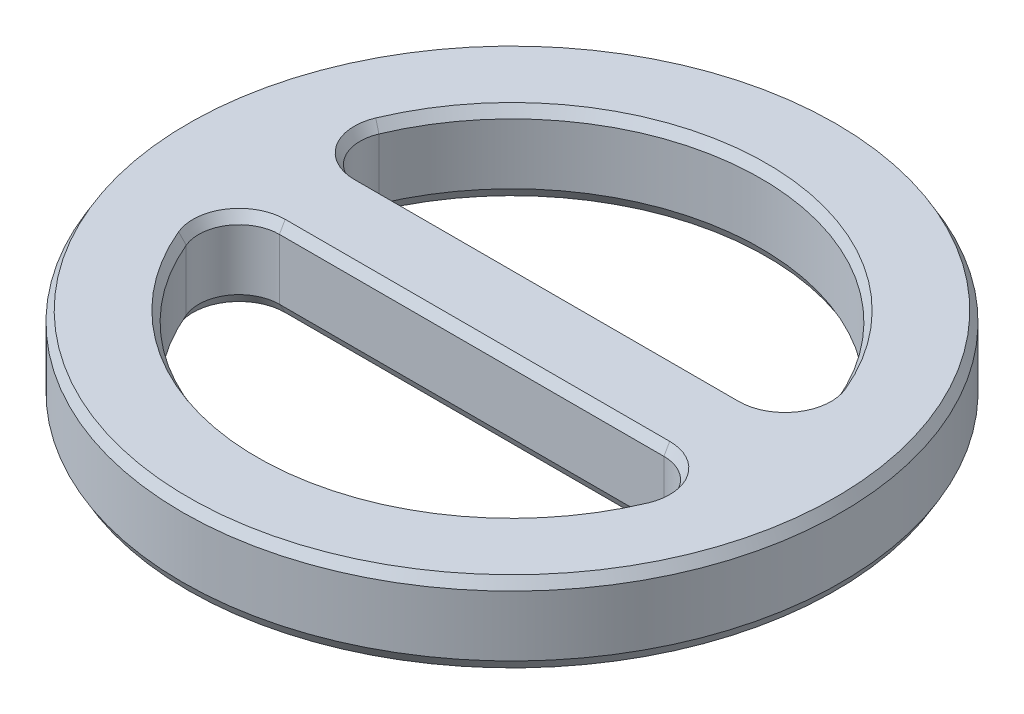
ISO-10303-21;
HEADER;
FILE_DESCRIPTION(('STEP AP214'),'2;1');
FILE_NAME('part.step','',(''),(''),'','','');
FILE_SCHEMA(('AUTOMOTIVE_DESIGN { 1 0 10303 214 1 1 1 1 }'));
ENDSEC;
DATA;
#1=APPLICATION_CONTEXT('core data for automotive mechanical design processes');
#2=APPLICATION_PROTOCOL_DEFINITION('international standard','automotive_design',2000,#1);
#3=PRODUCT_CONTEXT('',#1,'mechanical');
#4=PRODUCT('Part','Part','',(#3));
#5=PRODUCT_RELATED_PRODUCT_CATEGORY('part','',(#4));
#6=PRODUCT_DEFINITION_FORMATION('','',#4);
#7=PRODUCT_DEFINITION_CONTEXT('part definition',#1,'design');
#8=PRODUCT_DEFINITION('design','',#6,#7);
#9=PRODUCT_DEFINITION_SHAPE('','',#8);
#10=(LENGTH_UNIT() NAMED_UNIT(*) SI_UNIT(.MILLI.,.METRE.));
#11=(NAMED_UNIT(*) PLANE_ANGLE_UNIT() SI_UNIT($,.RADIAN.));
#12=(NAMED_UNIT(*) SI_UNIT($,.STERADIAN.) SOLID_ANGLE_UNIT());
#13=UNCERTAINTY_MEASURE_WITH_UNIT(LENGTH_MEASURE(1.E-05),#10,'distance_accuracy_value','');
#14=(GEOMETRIC_REPRESENTATION_CONTEXT(3) GLOBAL_UNCERTAINTY_ASSIGNED_CONTEXT((#13)) GLOBAL_UNIT_ASSIGNED_CONTEXT((#10,
#11,#12)) REPRESENTATION_CONTEXT('',''));
#15=CARTESIAN_POINT('',(0.,0.,0.));
#16=DIRECTION('',(0.,0.,1.));
#17=DIRECTION('',(1.,0.,0.));
#18=AXIS2_PLACEMENT_3D('',#15,#16,#17);
#19=CARTESIAN_POINT('',(0.,24.,0.));
#20=DIRECTION('',(0.,1.,0.));
#21=DIRECTION('',(0.,0.,1.));
#22=AXIS2_PLACEMENT_3D('',#19,#20,#21);
#23=PLANE('',#22);
#24=CARTESIAN_POINT('',(-57.1664237118258,24.,-24.));
#25=DIRECTION('',(0.,1.,0.));
#26=DIRECTION('',(0.,0.,1.));
#27=AXIS2_PLACEMENT_3D('',#24,#25,#26);
#28=CIRCLE('',#27,13.7320508075689);
#29=CARTESIAN_POINT('',(-57.1664237118258,24.,-10.2679491924311));
#30=VERTEX_POINT('',#29);
#31=CARTESIAN_POINT('',(-69.8279113714678,24.,-29.3156325706718));
#32=VERTEX_POINT('',#31);
#33=EDGE_CURVE('E204',#30,#32,#28,.F.);
#34=ORIENTED_EDGE('',*,*,#33,.T.);
#35=CARTESIAN_POINT('',(0.,24.,0.));
#36=DIRECTION('',(0.,1.,0.));
#37=DIRECTION('',(0.,0.,1.));
#38=AXIS2_PLACEMENT_3D('',#35,#36,#37);
#39=CIRCLE('',#38,75.7320508075689);
#40=CARTESIAN_POINT('',(69.8279113714678,24.,-29.3156325706718));
#41=VERTEX_POINT('',#40);
#42=EDGE_CURVE('E206',#32,#41,#39,.F.);
#43=ORIENTED_EDGE('',*,*,#42,.T.);
#44=CARTESIAN_POINT('',(57.1664237118258,24.,-24.));
#45=DIRECTION('',(0.,1.,0.));
#46=DIRECTION('',(0.,0.,1.));
#47=AXIS2_PLACEMENT_3D('',#44,#45,#46);
#48=CIRCLE('',#47,13.7320508075689);
#49=CARTESIAN_POINT('',(57.1664237118258,24.,-10.2679491924311));
#50=VERTEX_POINT('',#49);
#51=EDGE_CURVE('E202',#41,#50,#48,.F.);
#52=ORIENTED_EDGE('',*,*,#51,.T.);
#53=DIRECTION('',(-1.,0.,0.));
#54=VECTOR('',#53,1.);
#55=CARTESIAN_POINT('',(0.,24.,-10.2679491924311));
#56=LINE('',#55,#54);
#57=EDGE_CURVE('E200',#50,#30,#56,.T.);
#58=ORIENTED_EDGE('',*,*,#57,.T.);
#59=EDGE_LOOP('',(#34,#43,#52,#58));
#60=FACE_BOUND('',#59,.T.);
#61=CARTESIAN_POINT('',(57.1664237118258,24.,24.));
#62=DIRECTION('',(0.,1.,0.));
#63=DIRECTION('',(0.,0.,1.));
#64=AXIS2_PLACEMENT_3D('',#61,#62,#63);
#65=CIRCLE('',#64,13.7320508075689);
#66=CARTESIAN_POINT('',(57.1664237118258,24.,10.2679491924311));
#67=VERTEX_POINT('',#66);
#68=CARTESIAN_POINT('',(69.8279113714678,24.,29.3156325706719));
#69=VERTEX_POINT('',#68);
#70=EDGE_CURVE('E195',#67,#69,#65,.F.);
#71=ORIENTED_EDGE('',*,*,#70,.T.);
#72=CARTESIAN_POINT('',(0.,24.,0.));
#73=DIRECTION('',(0.,1.,0.));
#74=DIRECTION('',(0.,0.,1.));
#75=AXIS2_PLACEMENT_3D('',#72,#73,#74);
#76=CIRCLE('',#75,75.7320508075689);
#77=CARTESIAN_POINT('',(-69.8279113714678,24.,29.3156325706719));
#78=VERTEX_POINT('',#77);
#79=EDGE_CURVE('E197',#69,#78,#76,.F.);
#80=ORIENTED_EDGE('',*,*,#79,.T.);
#81=CARTESIAN_POINT('',(-57.1664237118258,24.,24.));
#82=DIRECTION('',(0.,1.,0.));
#83=DIRECTION('',(0.,0.,1.));
#84=AXIS2_PLACEMENT_3D('',#81,#82,#83);
#85=CIRCLE('',#84,13.7320508075689);
#86=CARTESIAN_POINT('',(-57.1664237118258,24.,10.2679491924311));
#87=VERTEX_POINT('',#86);
#88=EDGE_CURVE('E193',#78,#87,#85,.F.);
#89=ORIENTED_EDGE('',*,*,#88,.T.);
#90=DIRECTION('',(1.,0.,0.));
#91=VECTOR('',#90,1.);
#92=CARTESIAN_POINT('',(0.,24.,10.2679491924311));
#93=LINE('',#92,#91);
#94=EDGE_CURVE('E190',#87,#67,#93,.T.);
#95=ORIENTED_EDGE('',*,*,#94,.T.);
#96=EDGE_LOOP('',(#71,#80,#89,#95));
#97=FACE_BOUND('',#96,.T.);
#98=CARTESIAN_POINT('',(0.,24.,0.));
#99=DIRECTION('',(0.,1.,0.));
#100=DIRECTION('',(0.,0.,1.));
#101=AXIS2_PLACEMENT_3D('',#98,#99,#100);
#102=CIRCLE('',#101,96.2679491924311);
#103=CARTESIAN_POINT('',(0.,24.,-96.2679491924311));
#104=VERTEX_POINT('',#103);
#105=EDGE_CURVE('E316',#104,#104,#102,.T.);
#106=ORIENTED_EDGE('',*,*,#105,.T.);
#107=EDGE_LOOP('',(#106));
#108=FACE_BOUND('',#107,.T.);
#109=ADVANCED_FACE('F35',(#60,#97,#108),#23,.T.);
#110=CARTESIAN_POINT('',(0.,0.,0.));
#111=DIRECTION('',(0.,1.,0.));
#112=DIRECTION('',(0.,0.,1.));
#113=AXIS2_PLACEMENT_3D('',#110,#111,#112);
#114=PLANE('',#113);
#115=CARTESIAN_POINT('',(0.,0.,0.));
#116=DIRECTION('',(0.,1.,0.));
#117=DIRECTION('',(0.,0.,1.));
#118=AXIS2_PLACEMENT_3D('',#115,#116,#117);
#119=CIRCLE('',#118,96.2679491924311);
#120=CARTESIAN_POINT('',(0.,0.,96.2679491924311));
#121=VERTEX_POINT('',#120);
#122=EDGE_CURVE('E11',#121,#121,#119,.F.);
#123=ORIENTED_EDGE('',*,*,#122,.T.);
#124=EDGE_LOOP('',(#123));
#125=FACE_BOUND('',#124,.T.);
#126=CARTESIAN_POINT('',(-57.1664237118258,0.,-24.));
#127=DIRECTION('',(0.,1.,0.));
#128=DIRECTION('',(0.,0.,1.));
#129=AXIS2_PLACEMENT_3D('',#126,#127,#128);
#130=CIRCLE('',#129,13.7320508075689);
#131=CARTESIAN_POINT('',(-69.8279113714678,0.,-29.3156325706718));
#132=VERTEX_POINT('',#131);
#133=CARTESIAN_POINT('',(-57.1664237118258,0.,-10.2679491924311));
#134=VERTEX_POINT('',#133);
#135=EDGE_CURVE('E290',#132,#134,#130,.T.);
#136=ORIENTED_EDGE('',*,*,#135,.T.);
#137=DIRECTION('',(1.,0.,0.));
#138=VECTOR('',#137,1.);
#139=CARTESIAN_POINT('',(57.1664237118258,0.,-10.2679491924311));
#140=LINE('',#139,#138);
#141=CARTESIAN_POINT('',(57.1664237118258,0.,-10.2679491924311));
#142=VERTEX_POINT('',#141);
#143=EDGE_CURVE('E294',#134,#142,#140,.T.);
#144=ORIENTED_EDGE('',*,*,#143,.T.);
#145=CARTESIAN_POINT('',(57.1664237118258,0.,-24.));
#146=DIRECTION('',(0.,1.,0.));
#147=DIRECTION('',(0.,0.,1.));
#148=AXIS2_PLACEMENT_3D('',#145,#146,#147);
#149=CIRCLE('',#148,13.7320508075689);
#150=CARTESIAN_POINT('',(69.8279113714678,0.,-29.3156325706718));
#151=VERTEX_POINT('',#150);
#152=EDGE_CURVE('E292',#142,#151,#149,.T.);
#153=ORIENTED_EDGE('',*,*,#152,.T.);
#154=CARTESIAN_POINT('',(0.,0.,0.));
#155=DIRECTION('',(0.,1.,0.));
#156=DIRECTION('',(0.,0.,1.));
#157=AXIS2_PLACEMENT_3D('',#154,#155,#156);
#158=CIRCLE('',#157,75.7320508075689);
#159=EDGE_CURVE('E288',#151,#132,#158,.T.);
#160=ORIENTED_EDGE('',*,*,#159,.T.);
#161=EDGE_LOOP('',(#136,#144,#153,#160));
#162=FACE_BOUND('',#161,.T.);
#163=CARTESIAN_POINT('',(-57.1664237118258,0.,24.));
#164=DIRECTION('',(0.,1.,0.));
#165=DIRECTION('',(0.,0.,1.));
#166=AXIS2_PLACEMENT_3D('',#163,#164,#165);
#167=CIRCLE('',#166,13.7320508075689);
#168=CARTESIAN_POINT('',(-57.1664237118258,0.,10.2679491924311));
#169=VERTEX_POINT('',#168);
#170=CARTESIAN_POINT('',(-69.8279113714678,0.,29.3156325706719));
#171=VERTEX_POINT('',#170);
#172=EDGE_CURVE('E163',#169,#171,#167,.T.);
#173=ORIENTED_EDGE('',*,*,#172,.T.);
#174=CARTESIAN_POINT('',(0.,0.,0.));
#175=DIRECTION('',(0.,1.,0.));
#176=DIRECTION('',(0.,0.,1.));
#177=AXIS2_PLACEMENT_3D('',#174,#175,#176);
#178=CIRCLE('',#177,75.7320508075689);
#179=CARTESIAN_POINT('',(69.8279113714678,0.,29.3156325706719));
#180=VERTEX_POINT('',#179);
#181=EDGE_CURVE('E159',#171,#180,#178,.T.);
#182=ORIENTED_EDGE('',*,*,#181,.T.);
#183=CARTESIAN_POINT('',(57.1664237118258,0.,24.));
#184=DIRECTION('',(0.,1.,0.));
#185=DIRECTION('',(0.,0.,1.));
#186=AXIS2_PLACEMENT_3D('',#183,#184,#185);
#187=CIRCLE('',#186,13.7320508075689);
#188=CARTESIAN_POINT('',(57.1664237118258,0.,10.2679491924311));
#189=VERTEX_POINT('',#188);
#190=EDGE_CURVE('E153',#180,#189,#187,.T.);
#191=ORIENTED_EDGE('',*,*,#190,.T.);
#192=DIRECTION('',(-1.,0.,0.));
#193=VECTOR('',#192,1.);
#194=CARTESIAN_POINT('',(-57.1664237118258,0.,10.2679491924311));
#195=LINE('',#194,#193);
#196=EDGE_CURVE('E156',#189,#169,#195,.T.);
#197=ORIENTED_EDGE('',*,*,#196,.T.);
#198=EDGE_LOOP('',(#173,#182,#191,#197));
#199=FACE_BOUND('',#198,.T.);
#200=ADVANCED_FACE('F155',(#125,#162,#199),#114,.F.);
#201=CARTESIAN_POINT('',(0.,24.,0.));
#202=DIRECTION('',(0.,-1.,0.));
#203=DIRECTION('',(0.,0.,-1.));
#204=AXIS2_PLACEMENT_3D('',#201,#202,#203);
#205=CYLINDRICAL_SURFACE('',#204,98.);
#206=CARTESIAN_POINT('',(0.,2.99999999999998,0.));
#207=DIRECTION('',(0.,1.,0.));
#208=DIRECTION('',(0.,0.,1.));
#209=AXIS2_PLACEMENT_3D('',#206,#207,#208);
#210=CIRCLE('',#209,98.);
#211=CARTESIAN_POINT('',(0.,2.99999999999998,-98.));
#212=VERTEX_POINT('',#211);
#213=EDGE_CURVE('E45',#212,#212,#210,.T.);
#214=CARTESIAN_POINT('',(0.,21.,0.));
#215=DIRECTION('',(0.,1.,0.));
#216=DIRECTION('',(0.,0.,1.));
#217=AXIS2_PLACEMENT_3D('',#214,#215,#216);
#218=CIRCLE('',#217,98.);
#219=CARTESIAN_POINT('',(0.,21.,-98.));
#220=VERTEX_POINT('',#219);
#221=EDGE_CURVE('E191',#220,#220,#218,.F.);
#222=CARTESIAN_POINT('',(0.,2.99999999999998,-98.));
#223=CARTESIAN_POINT('',(0.,3.18749999999998,-98.));
#224=CARTESIAN_POINT('',(0.,3.37499999999998,-98.));
#225=CARTESIAN_POINT('',(0.,3.74999999999998,-98.));
#226=CARTESIAN_POINT('',(0.,3.93749999999998,-98.));
#227=CARTESIAN_POINT('',(0.,4.31249999999998,-98.));
#228=CARTESIAN_POINT('',(0.,4.49999999999998,-98.));
#229=CARTESIAN_POINT('',(0.,4.87499999999998,-98.));
#230=CARTESIAN_POINT('',(0.,5.06249999999998,-98.));
#231=CARTESIAN_POINT('',(0.,5.43749999999998,-98.));
#232=CARTESIAN_POINT('',(0.,5.62499999999998,-98.));
#233=CARTESIAN_POINT('',(0.,5.99999999999998,-98.));
#234=CARTESIAN_POINT('',(0.,6.18749999999998,-98.));
#235=CARTESIAN_POINT('',(0.,6.56249999999998,-98.));
#236=CARTESIAN_POINT('',(0.,6.74999999999998,-98.));
#237=CARTESIAN_POINT('',(0.,7.12499999999999,-98.));
#238=CARTESIAN_POINT('',(0.,7.31249999999999,-98.));
#239=CARTESIAN_POINT('',(0.,7.68749999999999,-98.));
#240=CARTESIAN_POINT('',(0.,7.87499999999999,-98.));
#241=CARTESIAN_POINT('',(0.,8.24999999999999,-98.));
#242=CARTESIAN_POINT('',(0.,8.43749999999999,-98.));
#243=CARTESIAN_POINT('',(0.,8.81249999999999,-98.));
#244=CARTESIAN_POINT('',(0.,8.99999999999999,-98.));
#245=CARTESIAN_POINT('',(0.,9.37499999999999,-98.));
#246=CARTESIAN_POINT('',(0.,9.56249999999999,-98.));
#247=CARTESIAN_POINT('',(0.,9.93749999999999,-98.));
#248=CARTESIAN_POINT('',(0.,10.125,-98.));
#249=CARTESIAN_POINT('',(0.,10.5,-98.));
#250=CARTESIAN_POINT('',(0.,10.6875,-98.));
#251=CARTESIAN_POINT('',(0.,11.0625,-98.));
#252=CARTESIAN_POINT('',(0.,11.25,-98.));
#253=CARTESIAN_POINT('',(0.,11.625,-98.));
#254=CARTESIAN_POINT('',(0.,11.8125,-98.));
#255=CARTESIAN_POINT('',(0.,12.1875,-98.));
#256=CARTESIAN_POINT('',(0.,12.375,-98.));
#257=CARTESIAN_POINT('',(0.,12.75,-98.));
#258=CARTESIAN_POINT('',(0.,12.9375,-98.));
#259=CARTESIAN_POINT('',(0.,13.3125,-98.));
#260=CARTESIAN_POINT('',(0.,13.5,-98.));
#261=CARTESIAN_POINT('',(0.,13.875,-98.));
#262=CARTESIAN_POINT('',(0.,14.0625,-98.));
#263=CARTESIAN_POINT('',(0.,14.4375,-98.));
#264=CARTESIAN_POINT('',(0.,14.625,-98.));
#265=CARTESIAN_POINT('',(0.,15.,-98.));
#266=CARTESIAN_POINT('',(0.,15.1875,-98.));
#267=CARTESIAN_POINT('',(0.,15.5625,-98.));
#268=CARTESIAN_POINT('',(0.,15.75,-98.));
#269=CARTESIAN_POINT('',(0.,16.125,-98.));
#270=CARTESIAN_POINT('',(0.,16.3125,-98.));
#271=CARTESIAN_POINT('',(0.,16.6875,-98.));
#272=CARTESIAN_POINT('',(0.,16.875,-98.));
#273=CARTESIAN_POINT('',(0.,17.25,-98.));
#274=CARTESIAN_POINT('',(0.,17.4375,-98.));
#275=CARTESIAN_POINT('',(0.,17.8125,-98.));
#276=CARTESIAN_POINT('',(0.,18.,-98.));
#277=CARTESIAN_POINT('',(0.,18.375,-98.));
#278=CARTESIAN_POINT('',(0.,18.5625,-98.));
#279=CARTESIAN_POINT('',(0.,18.9375,-98.));
#280=CARTESIAN_POINT('',(0.,19.125,-98.));
#281=CARTESIAN_POINT('',(0.,19.5,-98.));
#282=CARTESIAN_POINT('',(0.,19.6875,-98.));
#283=CARTESIAN_POINT('',(0.,20.0625,-98.));
#284=CARTESIAN_POINT('',(0.,20.25,-98.));
#285=CARTESIAN_POINT('',(0.,20.625,-98.));
#286=CARTESIAN_POINT('',(0.,20.8125,-98.));
#287=CARTESIAN_POINT('',(0.,21.,-98.));
#288=B_SPLINE_CURVE_WITH_KNOTS('',3,(#222,#223,#224,#225,#226,#227,#228,#229,#230,#231,#232,
#233,#234,#235,#236,#237,#238,#239,#240,#241,#242,#243,#244,#245,#246,#247,#248,#249,#250,#251,
#252,#253,#254,#255,#256,#257,#258,#259,#260,#261,#262,#263,#264,#265,#266,#267,#268,#269,#270,
#271,#272,#273,#274,#275,#276,#277,#278,#279,#280,#281,#282,#283,#284,#285,#286,#287),
.UNSPECIFIED.,.F.,.F.,(4,2,2,2,2,2,2,2,2,2,2,2,2,2,2,2,2,2,2,2,2,2,2,2,2,2,2,2,2,2,2,2,4),(0.,
0.5625,1.125,1.6875,2.25000000000001,2.81250000000001,3.37500000000001,3.93750000000001,
4.50000000000001,5.06250000000002,5.62500000000002,6.18750000000002,6.75000000000002,
7.31250000000002,7.87500000000002,8.43750000000002,9.00000000000002,9.56250000000003,10.125,
10.6875,11.25,11.8125,12.375,12.9375,13.5,14.0625,14.625,15.1875,15.75,16.3125,16.875,17.4375,
18.),.UNSPECIFIED.);
#289=EDGE_CURVE('BSEAM353',#212,#220,#288,.T.);
#290=ORIENTED_EDGE('',*,*,#213,.T.);
#291=ORIENTED_EDGE('',*,*,#221,.T.);
#292=ORIENTED_EDGE('',*,*,#289,.T.);
#293=ORIENTED_EDGE('',*,*,#289,.F.);
#294=EDGE_LOOP('',(#290,#292,#291,#293));
#295=FACE_BOUND('',#294,.T.);
#296=ADVANCED_FACE('F353',(#295),#205,.T.);
#297=CARTESIAN_POINT('',(0.,24.,0.));
#298=DIRECTION('',(0.,-1.,0.));
#299=DIRECTION('',(0.,0.,-1.));
#300=AXIS2_PLACEMENT_3D('',#297,#298,#299);
#301=CYLINDRICAL_SURFACE('',#300,74.);
#302=DIRECTION('',(0.,-1.,0.));
#303=VECTOR('',#302,1.);
#304=CARTESIAN_POINT('',(68.2308928173405,24.,-28.6451612903226));
#305=LINE('',#304,#303);
#306=CARTESIAN_POINT('',(68.2308928173405,3.00000000000003,-28.6451612903226));
#307=VERTEX_POINT('',#306);
#308=CARTESIAN_POINT('',(68.2308928173405,20.9999999999999,-28.6451612903226));
#309=VERTEX_POINT('',#308);
#310=EDGE_CURVE('E174',#307,#309,#305,.F.);
#311=ORIENTED_EDGE('',*,*,#310,.T.);
#312=CARTESIAN_POINT('',(0.,20.9999999999999,0.));
#313=DIRECTION('',(0.,1.,0.));
#314=DIRECTION('',(0.,0.,1.));
#315=AXIS2_PLACEMENT_3D('',#312,#313,#314);
#316=CIRCLE('',#315,74.);
#317=CARTESIAN_POINT('',(-68.2308928173405,20.9999999999999,-28.6451612903226));
#318=VERTEX_POINT('',#317);
#319=EDGE_CURVE('E187',#309,#318,#316,.T.);
#320=ORIENTED_EDGE('',*,*,#319,.T.);
#321=DIRECTION('',(0.,-1.,0.));
#322=VECTOR('',#321,1.);
#323=CARTESIAN_POINT('',(-68.2308928173405,24.,-28.6451612903226));
#324=LINE('',#323,#322);
#325=CARTESIAN_POINT('',(-68.2308928173405,3.00000000000003,-28.6451612903226));
#326=VERTEX_POINT('',#325);
#327=EDGE_CURVE('E282',#318,#326,#324,.T.);
#328=ORIENTED_EDGE('',*,*,#327,.T.);
#329=CARTESIAN_POINT('',(0.,3.00000000000003,0.));
#330=DIRECTION('',(0.,1.,0.));
#331=DIRECTION('',(0.,0.,1.));
#332=AXIS2_PLACEMENT_3D('',#329,#330,#331);
#333=CIRCLE('',#332,74.);
#334=EDGE_CURVE('E306',#326,#307,#333,.F.);
#335=ORIENTED_EDGE('',*,*,#334,.T.);
#336=EDGE_LOOP('',(#311,#320,#328,#335));
#337=FACE_BOUND('',#336,.T.);
#338=ADVANCED_FACE('F357',(#337),#301,.F.);
#339=CARTESIAN_POINT('',(-73.0205450541147,24.,-12.));
#340=DIRECTION('',(0.,0.,-1.));
#341=DIRECTION('',(-1.,0.,0.));
#342=AXIS2_PLACEMENT_3D('',#339,#340,#341);
#343=PLANE('',#342);
#344=DIRECTION('',(0.,1.,0.));
#345=VECTOR('',#344,1.);
#346=CARTESIAN_POINT('',(-57.1664237118258,24.,-12.));
#347=LINE('',#346,#345);
#348=CARTESIAN_POINT('',(-57.1664237118258,3.00000000000003,-12.));
#349=VERTEX_POINT('',#348);
#350=CARTESIAN_POINT('',(-57.1664237118258,20.9999999999999,-12.));
#351=VERTEX_POINT('',#350);
#352=EDGE_CURVE('E277',#349,#351,#347,.T.);
#353=ORIENTED_EDGE('',*,*,#352,.T.);
#354=DIRECTION('',(1.,0.,0.));
#355=VECTOR('',#354,1.);
#356=CARTESIAN_POINT('',(-73.0205450541147,20.9999999999999,-12.));
#357=LINE('',#356,#355);
#358=CARTESIAN_POINT('',(57.1664237118258,20.9999999999999,-12.));
#359=VERTEX_POINT('',#358);
#360=EDGE_CURVE('E213',#351,#359,#357,.T.);
#361=ORIENTED_EDGE('',*,*,#360,.T.);
#362=DIRECTION('',(0.,1.,0.));
#363=VECTOR('',#362,1.);
#364=CARTESIAN_POINT('',(57.1664237118258,0.,-12.));
#365=LINE('',#364,#363);
#366=CARTESIAN_POINT('',(57.1664237118258,3.00000000000003,-12.));
#367=VERTEX_POINT('',#366);
#368=EDGE_CURVE('E280',#359,#367,#365,.F.);
#369=ORIENTED_EDGE('',*,*,#368,.T.);
#370=DIRECTION('',(-1.,0.,0.));
#371=VECTOR('',#370,1.);
#372=CARTESIAN_POINT('',(-57.1664237118258,3.00000000000003,-12.));
#373=LINE('',#372,#371);
#374=EDGE_CURVE('E297',#367,#349,#373,.T.);
#375=ORIENTED_EDGE('',*,*,#374,.T.);
#376=EDGE_LOOP('',(#353,#361,#369,#375));
#377=FACE_BOUND('',#376,.T.);
#378=ADVANCED_FACE('F598',(#377),#343,.T.);
#379=CARTESIAN_POINT('',(0.,24.,0.));
#380=DIRECTION('',(0.,-1.,0.));
#381=DIRECTION('',(0.,0.,-1.));
#382=AXIS2_PLACEMENT_3D('',#379,#380,#381);
#383=CYLINDRICAL_SURFACE('',#382,74.);
#384=DIRECTION('',(0.,-1.,0.));
#385=VECTOR('',#384,1.);
#386=CARTESIAN_POINT('',(-68.2308928173405,24.,28.6451612903226));
#387=LINE('',#386,#385);
#388=CARTESIAN_POINT('',(-68.2308928173405,3.00000000000003,28.6451612903226));
#389=VERTEX_POINT('',#388);
#390=CARTESIAN_POINT('',(-68.2308928173405,21.,28.6451612903226));
#391=VERTEX_POINT('',#390);
#392=EDGE_CURVE('E266',#389,#391,#387,.F.);
#393=ORIENTED_EDGE('',*,*,#392,.T.);
#394=CARTESIAN_POINT('',(0.,21.,0.));
#395=DIRECTION('',(0.,1.,0.));
#396=DIRECTION('',(0.,0.,1.));
#397=AXIS2_PLACEMENT_3D('',#394,#395,#396);
#398=CIRCLE('',#397,74.);
#399=CARTESIAN_POINT('',(68.2308928173405,21.,28.6451612903226));
#400=VERTEX_POINT('',#399);
#401=EDGE_CURVE('E215',#391,#400,#398,.T.);
#402=ORIENTED_EDGE('',*,*,#401,.T.);
#403=DIRECTION('',(0.,-1.,0.));
#404=VECTOR('',#403,1.);
#405=CARTESIAN_POINT('',(68.2308928173405,24.,28.6451612903226));
#406=LINE('',#405,#404);
#407=CARTESIAN_POINT('',(68.2308928173405,3.00000000000003,28.6451612903226));
#408=VERTEX_POINT('',#407);
#409=EDGE_CURVE('E264',#400,#408,#406,.T.);
#410=ORIENTED_EDGE('',*,*,#409,.T.);
#411=CARTESIAN_POINT('',(0.,3.00000000000003,0.));
#412=DIRECTION('',(0.,1.,0.));
#413=DIRECTION('',(0.,0.,1.));
#414=AXIS2_PLACEMENT_3D('',#411,#412,#413);
#415=CIRCLE('',#414,74.);
#416=EDGE_CURVE('E308',#408,#389,#415,.F.);
#417=ORIENTED_EDGE('',*,*,#416,.T.);
#418=EDGE_LOOP('',(#393,#402,#410,#417));
#419=FACE_BOUND('',#418,.T.);
#420=ADVANCED_FACE('F262',(#419),#383,.F.);
#421=CARTESIAN_POINT('',(73.0205450541147,24.,12.));
#422=DIRECTION('',(0.,0.,1.));
#423=DIRECTION('',(1.,0.,0.));
#424=AXIS2_PLACEMENT_3D('',#421,#422,#423);
#425=PLANE('',#424);
#426=DIRECTION('',(0.,1.,0.));
#427=VECTOR('',#426,1.);
#428=CARTESIAN_POINT('',(57.1664237118258,24.,12.));
#429=LINE('',#428,#427);
#430=CARTESIAN_POINT('',(57.1664237118258,3.00000000000003,12.));
#431=VERTEX_POINT('',#430);
#432=CARTESIAN_POINT('',(57.1664237118258,21.,12.));
#433=VERTEX_POINT('',#432);
#434=EDGE_CURVE('E271',#431,#433,#429,.T.);
#435=ORIENTED_EDGE('',*,*,#434,.T.);
#436=DIRECTION('',(-1.,0.,0.));
#437=VECTOR('',#436,1.);
#438=CARTESIAN_POINT('',(73.0205450541147,21.,12.));
#439=LINE('',#438,#437);
#440=CARTESIAN_POINT('',(-57.1664237118258,21.,12.));
#441=VERTEX_POINT('',#440);
#442=EDGE_CURVE('E53',#433,#441,#439,.T.);
#443=ORIENTED_EDGE('',*,*,#442,.T.);
#444=DIRECTION('',(0.,1.,0.));
#445=VECTOR('',#444,1.);
#446=CARTESIAN_POINT('',(-57.1664237118258,0.,12.));
#447=LINE('',#446,#445);
#448=CARTESIAN_POINT('',(-57.1664237118258,3.00000000000003,12.));
#449=VERTEX_POINT('',#448);
#450=EDGE_CURVE('E269',#441,#449,#447,.F.);
#451=ORIENTED_EDGE('',*,*,#450,.T.);
#452=DIRECTION('',(1.,0.,0.));
#453=VECTOR('',#452,1.);
#454=CARTESIAN_POINT('',(57.1664237118258,3.00000000000003,12.));
#455=LINE('',#454,#453);
#456=EDGE_CURVE('E314',#449,#431,#455,.T.);
#457=ORIENTED_EDGE('',*,*,#456,.T.);
#458=EDGE_LOOP('',(#435,#443,#451,#457));
#459=FACE_BOUND('',#458,.T.);
#460=ADVANCED_FACE('F334',(#459),#425,.T.);
#461=CARTESIAN_POINT('',(57.1664237118258,24.,24.));
#462=DIRECTION('',(0.,-1.,0.));
#463=DIRECTION('',(0.,0.,-1.));
#464=AXIS2_PLACEMENT_3D('',#461,#462,#463);
#465=CYLINDRICAL_SURFACE('',#464,12.);
#466=ORIENTED_EDGE('',*,*,#409,.F.);
#467=CARTESIAN_POINT('',(57.1664237118258,21.,24.));
#468=DIRECTION('',(0.,1.,0.));
#469=DIRECTION('',(0.,0.,1.));
#470=AXIS2_PLACEMENT_3D('',#467,#468,#469);
#471=CIRCLE('',#470,12.);
#472=EDGE_CURVE('E61',#400,#433,#471,.T.);
#473=ORIENTED_EDGE('',*,*,#472,.T.);
#474=ORIENTED_EDGE('',*,*,#434,.F.);
#475=CARTESIAN_POINT('',(57.1664237118258,3.00000000000003,24.));
#476=DIRECTION('',(0.,1.,0.));
#477=DIRECTION('',(0.,0.,1.));
#478=AXIS2_PLACEMENT_3D('',#475,#476,#477);
#479=CIRCLE('',#478,12.);
#480=EDGE_CURVE('E178',#431,#408,#479,.F.);
#481=ORIENTED_EDGE('',*,*,#480,.T.);
#482=EDGE_LOOP('',(#466,#473,#474,#481));
#483=FACE_BOUND('',#482,.T.);
#484=ADVANCED_FACE('F267',(#483),#465,.F.);
#485=CARTESIAN_POINT('',(57.1664237118258,24.,-24.));
#486=DIRECTION('',(0.,-1.,0.));
#487=DIRECTION('',(0.,0.,-1.));
#488=AXIS2_PLACEMENT_3D('',#485,#486,#487);
#489=CYLINDRICAL_SURFACE('',#488,12.);
#490=ORIENTED_EDGE('',*,*,#368,.F.);
#491=CARTESIAN_POINT('',(57.1664237118258,20.9999999999999,-24.));
#492=DIRECTION('',(0.,1.,0.));
#493=DIRECTION('',(0.,0.,1.));
#494=AXIS2_PLACEMENT_3D('',#491,#492,#493);
#495=CIRCLE('',#494,12.);
#496=EDGE_CURVE('E211',#359,#309,#495,.T.);
#497=ORIENTED_EDGE('',*,*,#496,.T.);
#498=ORIENTED_EDGE('',*,*,#310,.F.);
#499=CARTESIAN_POINT('',(57.1664237118258,3.00000000000003,-24.));
#500=DIRECTION('',(0.,1.,0.));
#501=DIRECTION('',(0.,0.,1.));
#502=AXIS2_PLACEMENT_3D('',#499,#500,#501);
#503=CIRCLE('',#502,12.);
#504=EDGE_CURVE('E300',#307,#367,#503,.F.);
#505=ORIENTED_EDGE('',*,*,#504,.T.);
#506=EDGE_LOOP('',(#490,#497,#498,#505));
#507=FACE_BOUND('',#506,.T.);
#508=ADVANCED_FACE('F365',(#507),#489,.F.);
#509=CARTESIAN_POINT('',(-57.1664237118258,24.,-24.));
#510=DIRECTION('',(0.,-1.,0.));
#511=DIRECTION('',(0.,0.,-1.));
#512=AXIS2_PLACEMENT_3D('',#509,#510,#511);
#513=CYLINDRICAL_SURFACE('',#512,12.);
#514=ORIENTED_EDGE('',*,*,#327,.F.);
#515=CARTESIAN_POINT('',(-57.1664237118258,20.9999999999999,-24.));
#516=DIRECTION('',(0.,1.,0.));
#517=DIRECTION('',(0.,0.,1.));
#518=AXIS2_PLACEMENT_3D('',#515,#516,#517);
#519=CIRCLE('',#518,12.);
#520=EDGE_CURVE('E209',#318,#351,#519,.T.);
#521=ORIENTED_EDGE('',*,*,#520,.T.);
#522=ORIENTED_EDGE('',*,*,#352,.F.);
#523=CARTESIAN_POINT('',(-57.1664237118258,3.00000000000003,-24.));
#524=DIRECTION('',(0.,1.,0.));
#525=DIRECTION('',(0.,0.,1.));
#526=AXIS2_PLACEMENT_3D('',#523,#524,#525);
#527=CIRCLE('',#526,12.);
#528=EDGE_CURVE('E303',#349,#326,#527,.F.);
#529=ORIENTED_EDGE('',*,*,#528,.T.);
#530=EDGE_LOOP('',(#514,#521,#522,#529));
#531=FACE_BOUND('',#530,.T.);
#532=ADVANCED_FACE('F368',(#531),#513,.F.);
#533=CARTESIAN_POINT('',(-57.1664237118258,24.,24.));
#534=DIRECTION('',(0.,-1.,0.));
#535=DIRECTION('',(0.,0.,-1.));
#536=AXIS2_PLACEMENT_3D('',#533,#534,#535);
#537=CYLINDRICAL_SURFACE('',#536,12.);
#538=ORIENTED_EDGE('',*,*,#450,.F.);
#539=CARTESIAN_POINT('',(-57.1664237118258,21.,24.));
#540=DIRECTION('',(0.,1.,0.));
#541=DIRECTION('',(0.,0.,1.));
#542=AXIS2_PLACEMENT_3D('',#539,#540,#541);
#543=CIRCLE('',#542,12.);
#544=EDGE_CURVE('E219',#441,#391,#543,.T.);
#545=ORIENTED_EDGE('',*,*,#544,.T.);
#546=ORIENTED_EDGE('',*,*,#392,.F.);
#547=CARTESIAN_POINT('',(-57.1664237118258,3.00000000000003,24.));
#548=DIRECTION('',(0.,1.,0.));
#549=DIRECTION('',(0.,0.,1.));
#550=AXIS2_PLACEMENT_3D('',#547,#548,#549);
#551=CIRCLE('',#550,12.);
#552=EDGE_CURVE('E311',#389,#449,#551,.F.);
#553=ORIENTED_EDGE('',*,*,#552,.T.);
#554=EDGE_LOOP('',(#538,#545,#546,#553));
#555=FACE_BOUND('',#554,.T.);
#556=ADVANCED_FACE('F333',(#555),#537,.F.);
#557=CARTESIAN_POINT('',(0.,0.,0.));
#558=DIRECTION('',(0.,-1.,0.));
#559=DIRECTION('',(0.,0.,-1.));
#560=AXIS2_PLACEMENT_3D('',#557,#558,#559);
#561=CONICAL_SURFACE('',#560,75.7320508075689,0.5235987755983);
#562=DIRECTION('',(0.461019546063112,-0.866025403784438,-0.193548387096774));
#563=VECTOR('',#562,1.);
#564=CARTESIAN_POINT('',(68.2308928173405,3.00000000000003,-28.6451612903226));
#565=LINE('',#564,#563);
#566=EDGE_CURVE('E324',#307,#151,#565,.T.);
#567=ORIENTED_EDGE('',*,*,#566,.F.);
#568=ORIENTED_EDGE('',*,*,#334,.F.);
#569=DIRECTION('',(0.461019546063112,0.866025403784438,0.193548387096774));
#570=VECTOR('',#569,1.);
#571=CARTESIAN_POINT('',(-69.8279113714678,0.,-29.3156325706718));
#572=LINE('',#571,#570);
#573=EDGE_CURVE('E273',#132,#326,#572,.T.);
#574=ORIENTED_EDGE('',*,*,#573,.F.);
#575=ORIENTED_EDGE('',*,*,#159,.F.);
#576=EDGE_LOOP('',(#567,#568,#574,#575));
#577=FACE_BOUND('',#576,.T.);
#578=ADVANCED_FACE('F375',(#577),#561,.F.);
#579=CARTESIAN_POINT('',(-57.1664237118258,0.,-24.));
#580=DIRECTION('',(0.,-1.,0.));
#581=DIRECTION('',(0.,0.,-1.));
#582=AXIS2_PLACEMENT_3D('',#579,#580,#581);
#583=CONICAL_SURFACE('',#582,13.7320508075689,0.523598775598298);
#584=ORIENTED_EDGE('',*,*,#573,.T.);
#585=ORIENTED_EDGE('',*,*,#528,.F.);
#586=DIRECTION('',(0.,0.866025403784439,-0.499999999999999));
#587=VECTOR('',#586,1.);
#588=CARTESIAN_POINT('',(-57.1664237118258,0.,-10.2679491924311));
#589=LINE('',#588,#587);
#590=EDGE_CURVE('E322',#134,#349,#589,.T.);
#591=ORIENTED_EDGE('',*,*,#590,.F.);
#592=ORIENTED_EDGE('',*,*,#135,.F.);
#593=EDGE_LOOP('',(#584,#585,#591,#592));
#594=FACE_BOUND('',#593,.T.);
#595=ADVANCED_FACE('F390',(#594),#583,.F.);
#596=CARTESIAN_POINT('',(57.1664237118258,0.,-24.));
#597=DIRECTION('',(0.,-1.,0.));
#598=DIRECTION('',(0.,0.,-1.));
#599=AXIS2_PLACEMENT_3D('',#596,#597,#598);
#600=CONICAL_SURFACE('',#599,13.7320508075689,0.523598775598297);
#601=ORIENTED_EDGE('',*,*,#566,.T.);
#602=ORIENTED_EDGE('',*,*,#152,.F.);
#603=DIRECTION('',(0.,-0.866025403784439,0.499999999999999));
#604=VECTOR('',#603,1.);
#605=CARTESIAN_POINT('',(57.1664237118258,3.00000000000003,-12.));
#606=LINE('',#605,#604);
#607=EDGE_CURVE('E181',#367,#142,#606,.T.);
#608=ORIENTED_EDGE('',*,*,#607,.F.);
#609=ORIENTED_EDGE('',*,*,#504,.F.);
#610=EDGE_LOOP('',(#601,#602,#608,#609));
#611=FACE_BOUND('',#610,.T.);
#612=ADVANCED_FACE('F383',(#611),#600,.F.);
#613=CARTESIAN_POINT('',(0.,0.,-10.2679491924311));
#614=DIRECTION('',(0.,-0.499999999999998,-0.86602540378444));
#615=DIRECTION('',(-1.,0.,0.));
#616=AXIS2_PLACEMENT_3D('',#613,#614,#615);
#617=PLANE('',#616);
#618=ORIENTED_EDGE('',*,*,#590,.T.);
#619=ORIENTED_EDGE('',*,*,#374,.F.);
#620=ORIENTED_EDGE('',*,*,#607,.T.);
#621=ORIENTED_EDGE('',*,*,#143,.F.);
#622=EDGE_LOOP('',(#618,#619,#620,#621));
#623=FACE_BOUND('',#622,.T.);
#624=ADVANCED_FACE('F344',(#623),#617,.T.);
#625=CARTESIAN_POINT('',(0.,0.,10.2679491924311));
#626=DIRECTION('',(0.,-0.499999999999998,0.86602540378444));
#627=DIRECTION('',(1.,0.,0.));
#628=AXIS2_PLACEMENT_3D('',#625,#626,#627);
#629=PLANE('',#628);
#630=DIRECTION('',(0.,-0.86602540378444,-0.499999999999998));
#631=VECTOR('',#630,1.);
#632=CARTESIAN_POINT('',(57.1664237118258,3.00000000000003,12.));
#633=LINE('',#632,#631);
#634=EDGE_CURVE('E169',#431,#189,#633,.T.);
#635=ORIENTED_EDGE('',*,*,#634,.F.);
#636=ORIENTED_EDGE('',*,*,#456,.F.);
#637=DIRECTION('',(0.,0.86602540378444,0.499999999999998));
#638=VECTOR('',#637,1.);
#639=CARTESIAN_POINT('',(-57.1664237118258,0.,10.2679491924311));
#640=LINE('',#639,#638);
#641=EDGE_CURVE('E172',#169,#449,#640,.T.);
#642=ORIENTED_EDGE('',*,*,#641,.F.);
#643=ORIENTED_EDGE('',*,*,#196,.F.);
#644=EDGE_LOOP('',(#635,#636,#642,#643));
#645=FACE_BOUND('',#644,.T.);
#646=ADVANCED_FACE('F167',(#645),#629,.T.);
#647=CARTESIAN_POINT('',(-57.1664237118258,0.,24.));
#648=DIRECTION('',(0.,-1.,0.));
#649=DIRECTION('',(0.,0.,-1.));
#650=AXIS2_PLACEMENT_3D('',#647,#648,#649);
#651=CONICAL_SURFACE('',#650,13.7320508075689,0.523598775598297);
#652=ORIENTED_EDGE('',*,*,#641,.T.);
#653=ORIENTED_EDGE('',*,*,#552,.F.);
#654=DIRECTION('',(0.461019546063109,0.86602540378444,-0.193548387096773));
#655=VECTOR('',#654,1.);
#656=CARTESIAN_POINT('',(-69.8279113714678,0.,29.3156325706719));
#657=LINE('',#656,#655);
#658=EDGE_CURVE('E179',#171,#389,#657,.T.);
#659=ORIENTED_EDGE('',*,*,#658,.F.);
#660=ORIENTED_EDGE('',*,*,#172,.F.);
#661=EDGE_LOOP('',(#652,#653,#659,#660));
#662=FACE_BOUND('',#661,.T.);
#663=ADVANCED_FACE('F336',(#662),#651,.F.);
#664=CARTESIAN_POINT('',(57.1664237118258,0.,24.));
#665=DIRECTION('',(0.,-1.,0.));
#666=DIRECTION('',(0.,0.,-1.));
#667=AXIS2_PLACEMENT_3D('',#664,#665,#666);
#668=CONICAL_SURFACE('',#667,13.7320508075689,0.523598775598297);
#669=ORIENTED_EDGE('',*,*,#634,.T.);
#670=ORIENTED_EDGE('',*,*,#190,.F.);
#671=DIRECTION('',(0.461019546063109,-0.86602540378444,0.193548387096773));
#672=VECTOR('',#671,1.);
#673=CARTESIAN_POINT('',(68.2308928173405,3.00000000000003,28.6451612903226));
#674=LINE('',#673,#672);
#675=EDGE_CURVE('E183',#408,#180,#674,.T.);
#676=ORIENTED_EDGE('',*,*,#675,.F.);
#677=ORIENTED_EDGE('',*,*,#480,.F.);
#678=EDGE_LOOP('',(#669,#670,#676,#677));
#679=FACE_BOUND('',#678,.T.);
#680=ADVANCED_FACE('F176',(#679),#668,.F.);
#681=CARTESIAN_POINT('',(0.,0.,0.));
#682=DIRECTION('',(0.,-1.,0.));
#683=DIRECTION('',(0.,0.,-1.));
#684=AXIS2_PLACEMENT_3D('',#681,#682,#683);
#685=CONICAL_SURFACE('',#684,75.7320508075689,0.523598775598297);
#686=ORIENTED_EDGE('',*,*,#658,.T.);
#687=ORIENTED_EDGE('',*,*,#416,.F.);
#688=ORIENTED_EDGE('',*,*,#675,.T.);
#689=ORIENTED_EDGE('',*,*,#181,.F.);
#690=EDGE_LOOP('',(#686,#687,#688,#689));
#691=FACE_BOUND('',#690,.T.);
#692=ADVANCED_FACE('F329',(#691),#685,.F.);
#693=CARTESIAN_POINT('',(0.,24.,0.));
#694=DIRECTION('',(0.,-1.,0.));
#695=DIRECTION('',(0.,0.,-1.));
#696=AXIS2_PLACEMENT_3D('',#693,#694,#695);
#697=CONICAL_SURFACE('',#696,96.2679491924311,0.523598775598305);
#698=CARTESIAN_POINT('',(0.,21.,-98.));
#699=CARTESIAN_POINT('',(0.,21.03125,-97.9819578040878));
#700=CARTESIAN_POINT('',(0.,21.0625,-97.9639156081757));
#701=CARTESIAN_POINT('',(0.,21.125,-97.9278312163513));
#702=CARTESIAN_POINT('',(0.,21.15625,-97.9097890204391));
#703=CARTESIAN_POINT('',(0.,21.21875,-97.8737046286148));
#704=CARTESIAN_POINT('',(0.,21.25,-97.8556624327026));
#705=CARTESIAN_POINT('',(0.,21.3125,-97.8195780408783));
#706=CARTESIAN_POINT('',(0.,21.34375,-97.8015358449661));
#707=CARTESIAN_POINT('',(0.,21.40625,-97.7654514531417));
#708=CARTESIAN_POINT('',(0.,21.4375,-97.7474092572295));
#709=CARTESIAN_POINT('',(0.,21.5,-97.7113248654052));
#710=CARTESIAN_POINT('',(0.,21.53125,-97.693282669493));
#711=CARTESIAN_POINT('',(0.,21.59375,-97.6571982776687));
#712=CARTESIAN_POINT('',(0.,21.625,-97.6391560817565));
#713=CARTESIAN_POINT('',(0.,21.6875,-97.6030716899321));
#714=CARTESIAN_POINT('',(0.,21.71875,-97.5850294940199));
#715=CARTESIAN_POINT('',(0.,21.78125,-97.5489451021956));
#716=CARTESIAN_POINT('',(0.,21.8125,-97.5309029062834));
#717=CARTESIAN_POINT('',(0.,21.875,-97.4948185144591));
#718=CARTESIAN_POINT('',(0.,21.90625,-97.4767763185469));
#719=CARTESIAN_POINT('',(0.,21.96875,-97.4406919267226));
#720=CARTESIAN_POINT('',(0.,22.,-97.4226497308104));
#721=CARTESIAN_POINT('',(0.,22.0625,-97.386565338986));
#722=CARTESIAN_POINT('',(0.,22.09375,-97.3685231430738));
#723=CARTESIAN_POINT('',(0.,22.15625,-97.3324387512495));
#724=CARTESIAN_POINT('',(0.,22.1875,-97.3143965553373));
#725=CARTESIAN_POINT('',(0.,22.25,-97.278312163513));
#726=CARTESIAN_POINT('',(0.,22.28125,-97.2602699676008));
#727=CARTESIAN_POINT('',(0.,22.34375,-97.2241855757764));
#728=CARTESIAN_POINT('',(0.,22.375,-97.2061433798643));
#729=CARTESIAN_POINT('',(0.,22.4375,-97.1700589880399));
#730=CARTESIAN_POINT('',(0.,22.46875,-97.1520167921277));
#731=CARTESIAN_POINT('',(0.,22.53125,-97.1159324003034));
#732=CARTESIAN_POINT('',(0.,22.5625,-97.0978902043912));
#733=CARTESIAN_POINT('',(0.,22.625,-97.0618058125669));
#734=CARTESIAN_POINT('',(0.,22.65625,-97.0437636166547));
#735=CARTESIAN_POINT('',(0.,22.71875,-97.0076792248303));
#736=CARTESIAN_POINT('',(0.,22.75,-96.9896370289182));
#737=CARTESIAN_POINT('',(0.,22.8125,-96.9535526370938));
#738=CARTESIAN_POINT('',(0.,22.84375,-96.9355104411816));
#739=CARTESIAN_POINT('',(0.,22.90625,-96.8994260493573));
#740=CARTESIAN_POINT('',(0.,22.9375,-96.8813838534451));
#741=CARTESIAN_POINT('',(0.,23.,-96.8452994616208));
#742=CARTESIAN_POINT('',(0.,23.03125,-96.8272572657086));
#743=CARTESIAN_POINT('',(0.,23.09375,-96.7911728738842));
#744=CARTESIAN_POINT('',(0.,23.125,-96.773130677972));
#745=CARTESIAN_POINT('',(0.,23.1875,-96.7370462861477));
#746=CARTESIAN_POINT('',(0.,23.21875,-96.7190040902355));
#747=CARTESIAN_POINT('',(0.,23.28125,-96.6829196984112));
#748=CARTESIAN_POINT('',(0.,23.3125,-96.664877502499));
#749=CARTESIAN_POINT('',(0.,23.375,-96.6287931106746));
#750=CARTESIAN_POINT('',(0.,23.40625,-96.6107509147625));
#751=CARTESIAN_POINT('',(0.,23.46875,-96.5746665229381));
#752=CARTESIAN_POINT('',(0.,23.5,-96.5566243270259));
#753=CARTESIAN_POINT('',(0.,23.5625,-96.5205399352016));
#754=CARTESIAN_POINT('',(0.,23.59375,-96.5024977392894));
#755=CARTESIAN_POINT('',(0.,23.65625,-96.4664133474651));
#756=CARTESIAN_POINT('',(0.,23.6875,-96.4483711515529));
#757=CARTESIAN_POINT('',(0.,23.75,-96.4122867597285));
#758=CARTESIAN_POINT('',(0.,23.78125,-96.3942445638163));
#759=CARTESIAN_POINT('',(0.,23.84375,-96.358160171992));
#760=CARTESIAN_POINT('',(0.,23.875,-96.3401179760798));
#761=CARTESIAN_POINT('',(0.,23.9375,-96.3040335842555));
#762=CARTESIAN_POINT('',(0.,23.96875,-96.2859913883433));
#763=CARTESIAN_POINT('',(0.,24.,-96.2679491924311));
#764=B_SPLINE_CURVE_WITH_KNOTS('',3,(#698,#699,#700,#701,#702,#703,#704,#705,#706,#707,#708,
#709,#710,#711,#712,#713,#714,#715,#716,#717,#718,#719,#720,#721,#722,#723,#724,#725,#726,#727,
#728,#729,#730,#731,#732,#733,#734,#735,#736,#737,#738,#739,#740,#741,#742,#743,#744,#745,#746,
#747,#748,#749,#750,#751,#752,#753,#754,#755,#756,#757,#758,#759,#760,#761,#762,#763),
.UNSPECIFIED.,.F.,.F.,(4,2,2,2,2,2,2,2,2,2,2,2,2,2,2,2,2,2,2,2,2,2,2,2,2,2,2,2,2,2,2,2,4),(0.,
0.108253175473055,0.21650635094611,0.324759526419165,0.433012701892217,0.541265877365272,
0.649519052838327,0.757772228311382,0.866025403784434,0.974278579257489,1.08253175473054,
1.1907849302036,1.29903810567665,1.40729128114971,1.51554445662276,1.62379763209582,
1.73205080756887,1.84030398304192,1.94855715851498,2.05681033398803,2.16506350946109,
2.27331668493414,2.3815698604072,2.48982303588025,2.5980762113533,2.70632938682636,
2.81458256229941,2.92283573777247,3.03108891324552,3.13934208871857,3.24759526419163,
3.35584843966468,3.46410161513774),.UNSPECIFIED.);
#765=EDGE_CURVE('BSEAM409',#220,#104,#764,.T.);
#766=ORIENTED_EDGE('',*,*,#221,.F.);
#767=ORIENTED_EDGE('',*,*,#105,.F.);
#768=ORIENTED_EDGE('',*,*,#765,.T.);
#769=ORIENTED_EDGE('',*,*,#765,.F.);
#770=EDGE_LOOP('',(#766,#768,#767,#769));
#771=FACE_BOUND('',#770,.T.);
#772=ADVANCED_FACE('F409',(#771),#697,.T.);
#773=CARTESIAN_POINT('',(-73.0205450541147,20.9999999999999,-12.));
#774=DIRECTION('',(0.,-0.499999999999997,0.86602540378444));
#775=DIRECTION('',(1.,0.,0.));
#776=AXIS2_PLACEMENT_3D('',#773,#774,#775);
#777=PLANE('',#776);
#778=DIRECTION('',(0.,-0.86602540378444,-0.499999999999997));
#779=VECTOR('',#778,1.);
#780=CARTESIAN_POINT('',(-57.1664237118258,24.,-10.2679491924311));
#781=LINE('',#780,#779);
#782=EDGE_CURVE('E228',#30,#351,#781,.T.);
#783=ORIENTED_EDGE('',*,*,#782,.F.);
#784=ORIENTED_EDGE('',*,*,#57,.F.);
#785=DIRECTION('',(0.,0.86602540378444,0.499999999999997));
#786=VECTOR('',#785,1.);
#787=CARTESIAN_POINT('',(57.1664237118258,20.9999999999999,-12.));
#788=LINE('',#787,#786);
#789=EDGE_CURVE('E231',#359,#50,#788,.T.);
#790=ORIENTED_EDGE('',*,*,#789,.F.);
#791=ORIENTED_EDGE('',*,*,#360,.F.);
#792=EDGE_LOOP('',(#783,#784,#790,#791));
#793=FACE_BOUND('',#792,.T.);
#794=ADVANCED_FACE('F422',(#793),#777,.F.);
#795=CARTESIAN_POINT('',(57.1664237118258,24.,-24.));
#796=DIRECTION('',(0.,1.,0.));
#797=DIRECTION('',(0.,0.,1.));
#798=AXIS2_PLACEMENT_3D('',#795,#796,#797);
#799=CONICAL_SURFACE('',#798,13.7320508075689,0.523598775598295);
#800=ORIENTED_EDGE('',*,*,#789,.T.);
#801=ORIENTED_EDGE('',*,*,#51,.F.);
#802=DIRECTION('',(0.461019546063109,0.86602540378444,-0.193548387096773));
#803=VECTOR('',#802,1.);
#804=CARTESIAN_POINT('',(68.2308928173405,20.9999999999999,-28.6451612903226));
#805=LINE('',#804,#803);
#806=EDGE_CURVE('E226',#309,#41,#805,.T.);
#807=ORIENTED_EDGE('',*,*,#806,.F.);
#808=ORIENTED_EDGE('',*,*,#496,.F.);
#809=EDGE_LOOP('',(#800,#801,#807,#808));
#810=FACE_BOUND('',#809,.T.);
#811=ADVANCED_FACE('F439',(#810),#799,.F.);
#812=CARTESIAN_POINT('',(-57.1664237118258,24.,-24.));
#813=DIRECTION('',(0.,1.,0.));
#814=DIRECTION('',(0.,0.,1.));
#815=AXIS2_PLACEMENT_3D('',#812,#813,#814);
#816=CONICAL_SURFACE('',#815,13.7320508075689,0.523598775598294);
#817=ORIENTED_EDGE('',*,*,#782,.T.);
#818=ORIENTED_EDGE('',*,*,#520,.F.);
#819=DIRECTION('',(0.461019546063109,-0.86602540378444,0.193548387096772));
#820=VECTOR('',#819,1.);
#821=CARTESIAN_POINT('',(-69.8279113714678,24.,-29.3156325706718));
#822=LINE('',#821,#820);
#823=EDGE_CURVE('E224',#32,#318,#822,.T.);
#824=ORIENTED_EDGE('',*,*,#823,.F.);
#825=ORIENTED_EDGE('',*,*,#33,.F.);
#826=EDGE_LOOP('',(#817,#818,#824,#825));
#827=FACE_BOUND('',#826,.T.);
#828=ADVANCED_FACE('F432',(#827),#816,.F.);
#829=CARTESIAN_POINT('',(0.,20.9999999999999,0.));
#830=DIRECTION('',(0.,1.,0.));
#831=DIRECTION('',(0.,0.,1.));
#832=AXIS2_PLACEMENT_3D('',#829,#830,#831);
#833=CONICAL_SURFACE('',#832,74.,0.523598775598295);
#834=ORIENTED_EDGE('',*,*,#806,.T.);
#835=ORIENTED_EDGE('',*,*,#42,.F.);
#836=ORIENTED_EDGE('',*,*,#823,.T.);
#837=ORIENTED_EDGE('',*,*,#319,.F.);
#838=EDGE_LOOP('',(#834,#835,#836,#837));
#839=FACE_BOUND('',#838,.T.);
#840=ADVANCED_FACE('F425',(#839),#833,.F.);
#841=CARTESIAN_POINT('',(73.0205450541147,21.,12.));
#842=DIRECTION('',(0.,-0.499999999999998,-0.86602540378444));
#843=DIRECTION('',(-1.,0.,0.));
#844=AXIS2_PLACEMENT_3D('',#841,#842,#843);
#845=PLANE('',#844);
#846=DIRECTION('',(0.,-0.86602540378444,0.499999999999998));
#847=VECTOR('',#846,1.);
#848=CARTESIAN_POINT('',(57.1664237118258,24.,10.2679491924311));
#849=LINE('',#848,#847);
#850=EDGE_CURVE('E237',#67,#433,#849,.T.);
#851=ORIENTED_EDGE('',*,*,#850,.F.);
#852=ORIENTED_EDGE('',*,*,#94,.F.);
#853=DIRECTION('',(0.,0.86602540378444,-0.499999999999998));
#854=VECTOR('',#853,1.);
#855=CARTESIAN_POINT('',(-57.1664237118258,21.,12.));
#856=LINE('',#855,#854);
#857=EDGE_CURVE('E40',#441,#87,#856,.T.);
#858=ORIENTED_EDGE('',*,*,#857,.F.);
#859=ORIENTED_EDGE('',*,*,#442,.F.);
#860=EDGE_LOOP('',(#851,#852,#858,#859));
#861=FACE_BOUND('',#860,.T.);
#862=ADVANCED_FACE('F251',(#861),#845,.F.);
#863=CARTESIAN_POINT('',(-57.1664237118258,24.,24.));
#864=DIRECTION('',(0.,1.,0.));
#865=DIRECTION('',(0.,0.,1.));
#866=AXIS2_PLACEMENT_3D('',#863,#864,#865);
#867=CONICAL_SURFACE('',#866,13.7320508075689,0.523598775598297);
#868=ORIENTED_EDGE('',*,*,#857,.T.);
#869=ORIENTED_EDGE('',*,*,#88,.F.);
#870=DIRECTION('',(-0.461019546063109,0.86602540378444,0.193548387096773));
#871=VECTOR('',#870,1.);
#872=CARTESIAN_POINT('',(-68.2308928173405,21.,28.6451612903226));
#873=LINE('',#872,#871);
#874=EDGE_CURVE('E236',#391,#78,#873,.T.);
#875=ORIENTED_EDGE('',*,*,#874,.F.);
#876=ORIENTED_EDGE('',*,*,#544,.F.);
#877=EDGE_LOOP('',(#868,#869,#875,#876));
#878=FACE_BOUND('',#877,.T.);
#879=ADVANCED_FACE('F247',(#878),#867,.F.);
#880=CARTESIAN_POINT('',(57.1664237118258,24.,24.));
#881=DIRECTION('',(0.,1.,0.));
#882=DIRECTION('',(0.,0.,1.));
#883=AXIS2_PLACEMENT_3D('',#880,#881,#882);
#884=CONICAL_SURFACE('',#883,13.7320508075689,0.523598775598297);
#885=ORIENTED_EDGE('',*,*,#850,.T.);
#886=ORIENTED_EDGE('',*,*,#472,.F.);
#887=DIRECTION('',(-0.461019546063109,-0.86602540378444,-0.193548387096773));
#888=VECTOR('',#887,1.);
#889=CARTESIAN_POINT('',(69.8279113714678,24.,29.3156325706719));
#890=LINE('',#889,#888);
#891=EDGE_CURVE('E234',#69,#400,#890,.T.);
#892=ORIENTED_EDGE('',*,*,#891,.F.);
#893=ORIENTED_EDGE('',*,*,#70,.F.);
#894=EDGE_LOOP('',(#885,#886,#892,#893));
#895=FACE_BOUND('',#894,.T.);
#896=ADVANCED_FACE('F259',(#895),#884,.F.);
#897=CARTESIAN_POINT('',(0.,21.,0.));
#898=DIRECTION('',(0.,1.,0.));
#899=DIRECTION('',(0.,0.,1.));
#900=AXIS2_PLACEMENT_3D('',#897,#898,#899);
#901=CONICAL_SURFACE('',#900,74.,0.523598775598297);
#902=ORIENTED_EDGE('',*,*,#874,.T.);
#903=ORIENTED_EDGE('',*,*,#79,.F.);
#904=ORIENTED_EDGE('',*,*,#891,.T.);
#905=ORIENTED_EDGE('',*,*,#401,.F.);
#906=EDGE_LOOP('',(#902,#903,#904,#905));
#907=FACE_BOUND('',#906,.T.);
#908=ADVANCED_FACE('F257',(#907),#901,.F.);
#909=CARTESIAN_POINT('',(0.,2.99999999999998,0.));
#910=DIRECTION('',(0.,1.,0.));
#911=DIRECTION('',(0.,0.,1.));
#912=AXIS2_PLACEMENT_3D('',#909,#910,#911);
#913=CONICAL_SURFACE('',#912,98.,0.523598775598305);
#914=ORIENTED_EDGE('',*,*,#122,.F.);
#915=EDGE_LOOP('',(#914));
#916=FACE_BOUND('',#915,.T.);
#917=ORIENTED_EDGE('',*,*,#213,.F.);
#918=EDGE_LOOP('',(#917));
#919=FACE_BOUND('',#918,.T.);
#920=ADVANCED_FACE('F38',(#916,#919),#913,.T.);
#921=CLOSED_SHELL('',(#109,#200,#296,#338,#378,#420,#460,#484,#508,#532,#556,#578,#595,#612,
#624,#646,#663,#680,#692,#772,#794,#811,#828,#840,#862,#879,#896,#908,#920));
#922=MANIFOLD_SOLID_BREP('B2',#921);
#923=ADVANCED_BREP_SHAPE_REPRESENTATION('',(#18,#922),#14);
#924=SHAPE_DEFINITION_REPRESENTATION(#9,#923);
ENDSEC;
END-ISO-10303-21;
